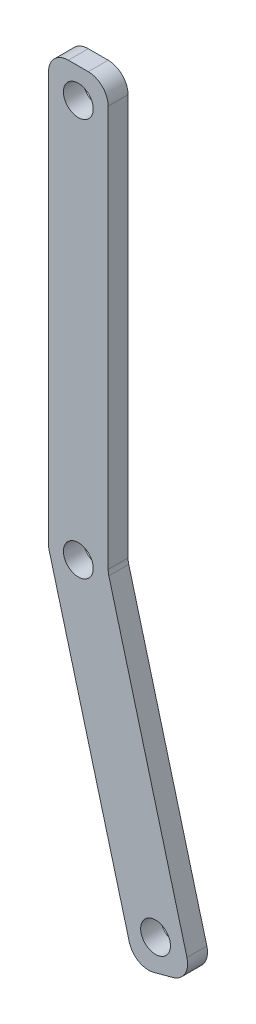
ISO-10303-21;
HEADER;
FILE_DESCRIPTION(('STEP AP214'),'2;1');
FILE_NAME('part.step','',(''),(''),'','','');
FILE_SCHEMA(('AUTOMOTIVE_DESIGN { 1 0 10303 214 1 1 1 1 }'));
ENDSEC;
DATA;
#1=APPLICATION_CONTEXT('core data for automotive mechanical design processes');
#2=APPLICATION_PROTOCOL_DEFINITION('international standard','automotive_design',2000,#1);
#3=PRODUCT_CONTEXT('',#1,'mechanical');
#4=PRODUCT('Part','Part','',(#3));
#5=PRODUCT_RELATED_PRODUCT_CATEGORY('part','',(#4));
#6=PRODUCT_DEFINITION_FORMATION('','',#4);
#7=PRODUCT_DEFINITION_CONTEXT('part definition',#1,'design');
#8=PRODUCT_DEFINITION('design','',#6,#7);
#9=PRODUCT_DEFINITION_SHAPE('','',#8);
#10=(LENGTH_UNIT() NAMED_UNIT(*) SI_UNIT(.MILLI.,.METRE.));
#11=(NAMED_UNIT(*) PLANE_ANGLE_UNIT() SI_UNIT($,.RADIAN.));
#12=(NAMED_UNIT(*) SI_UNIT($,.STERADIAN.) SOLID_ANGLE_UNIT());
#13=UNCERTAINTY_MEASURE_WITH_UNIT(LENGTH_MEASURE(1.E-05),#10,'distance_accuracy_value','');
#14=(GEOMETRIC_REPRESENTATION_CONTEXT(3) GLOBAL_UNCERTAINTY_ASSIGNED_CONTEXT((#13)) GLOBAL_UNIT_ASSIGNED_CONTEXT((#10,
#11,#12)) REPRESENTATION_CONTEXT('',''));
#15=CARTESIAN_POINT('',(0.,0.,0.));
#16=DIRECTION('',(0.,0.,1.));
#17=DIRECTION('',(1.,0.,0.));
#18=AXIS2_PLACEMENT_3D('',#15,#16,#17);
#19=CARTESIAN_POINT('',(-7.89777747886712,-2.1162030974631,2.));
#20=DIRECTION('',(-0.96592582628907,-0.258819045102515,0.));
#21=DIRECTION('',(0.258819045102515,-0.96592582628907,0.));
#22=AXIS2_PLACEMENT_3D('',#19,#20,#21);
#23=PLANE('',#22);
#24=DIRECTION('',(-0.258819045102515,0.96592582628907,0.));
#25=VECTOR('',#24,1.);
#26=CARTESIAN_POINT('',(-7.89777747886712,-2.1162030974631,0.));
#27=LINE('',#26,#25);
#28=CARTESIAN_POINT('',(5.12561291931073,-50.7201577502687,0.));
#29=VERTEX_POINT('',#28);
#30=CARTESIAN_POINT('',(-2.93185165257814,-20.6492905877925,0.));
#31=VERTEX_POINT('',#30);
#32=EDGE_CURVE('E152',#29,#31,#27,.T.);
#33=ORIENTED_EDGE('',*,*,#32,.F.);
#34=DIRECTION('',(0.,0.,-1.));
#35=VECTOR('',#34,1.);
#36=CARTESIAN_POINT('',(5.12561291931073,-50.7201577502687,2.));
#37=LINE('',#36,#35);
#38=CARTESIAN_POINT('',(5.12561291931073,-50.7201577502687,2.));
#39=VERTEX_POINT('',#38);
#40=EDGE_CURVE('E129',#29,#39,#37,.F.);
#41=ORIENTED_EDGE('',*,*,#40,.T.);
#42=DIRECTION('',(-0.258819045102515,0.96592582628907,0.));
#43=VECTOR('',#42,1.);
#44=CARTESIAN_POINT('',(-7.89777747886712,-2.1162030974631,2.));
#45=LINE('',#44,#43);
#46=CARTESIAN_POINT('',(-2.93185165257814,-20.6492905877925,2.));
#47=VERTEX_POINT('',#46);
#48=EDGE_CURVE('E177',#39,#47,#45,.T.);
#49=ORIENTED_EDGE('',*,*,#48,.T.);
#50=DIRECTION('',(0.,0.,-1.));
#51=VECTOR('',#50,1.);
#52=CARTESIAN_POINT('',(-2.93185165257814,-20.6492905877925,2.));
#53=LINE('',#52,#51);
#54=EDGE_CURVE('E134',#47,#31,#53,.T.);
#55=ORIENTED_EDGE('',*,*,#54,.T.);
#56=EDGE_LOOP('',(#33,#41,#49,#55));
#57=FACE_BOUND('',#56,.T.);
#58=ADVANCED_FACE('F34',(#57),#23,.T.);
#59=CARTESIAN_POINT('',(13.5410284883829,-50.5358063053838,2.));
#60=DIRECTION('',(-0.258819045102515,0.96592582628907,0.));
#61=DIRECTION('',(-0.96592582628907,-0.258819045102515,0.));
#62=AXIS2_PLACEMENT_3D('',#59,#60,#61);
#63=PLANE('',#62);
#64=DIRECTION('',(0.96592582628907,0.258819045102515,0.));
#65=VECTOR('',#64,1.);
#66=CARTESIAN_POINT('',(13.5410284883829,-50.5358063053838,2.));
#67=LINE('',#66,#65);
#68=CARTESIAN_POINT('',(7.5751026620939,-52.1343713126418,2.));
#69=VERTEX_POINT('',#68);
#70=CARTESIAN_POINT('',(9.50695431467204,-51.6167332224368,2.));
#71=VERTEX_POINT('',#70);
#72=EDGE_CURVE('E144',#69,#71,#67,.T.);
#73=ORIENTED_EDGE('',*,*,#72,.F.);
#74=DIRECTION('',(0.,0.,-1.));
#75=VECTOR('',#74,1.);
#76=CARTESIAN_POINT('',(7.5751026620939,-52.1343713126418,0.));
#77=LINE('',#76,#75);
#78=CARTESIAN_POINT('',(7.5751026620939,-52.1343713126418,0.));
#79=VERTEX_POINT('',#78);
#80=EDGE_CURVE('E128',#69,#79,#77,.T.);
#81=ORIENTED_EDGE('',*,*,#80,.T.);
#82=DIRECTION('',(0.96592582628907,0.258819045102515,0.));
#83=VECTOR('',#82,1.);
#84=CARTESIAN_POINT('',(13.5410284883829,-50.5358063053838,0.));
#85=LINE('',#84,#83);
#86=CARTESIAN_POINT('',(9.50695431467204,-51.6167332224368,0.));
#87=VERTEX_POINT('',#86);
#88=EDGE_CURVE('E141',#79,#87,#85,.T.);
#89=ORIENTED_EDGE('',*,*,#88,.T.);
#90=DIRECTION('',(0.,0.,-1.));
#91=VECTOR('',#90,1.);
#92=CARTESIAN_POINT('',(9.50695431467204,-51.6167332224368,2.));
#93=LINE('',#92,#91);
#94=EDGE_CURVE('E146',#87,#71,#93,.F.);
#95=ORIENTED_EDGE('',*,*,#94,.T.);
#96=EDGE_LOOP('',(#73,#81,#89,#95));
#97=FACE_BOUND('',#96,.T.);
#98=ADVANCED_FACE('F140',(#97),#63,.F.);
#99=CARTESIAN_POINT('',(-2.10222252113271,-0.563288826848014,2.));
#100=DIRECTION('',(-0.96592582628907,-0.258819045102515,0.));
#101=DIRECTION('',(0.258819045102515,-0.96592582628907,0.));
#102=AXIS2_PLACEMENT_3D('',#99,#100,#101);
#103=PLANE('',#102);
#104=DIRECTION('',(-0.258819045102515,0.96592582628907,0.));
#105=VECTOR('',#104,1.);
#106=CARTESIAN_POINT('',(-2.10222252113271,-0.563288826848014,2.));
#107=LINE('',#106,#105);
#108=CARTESIAN_POINT('',(10.9211678770451,-49.1672434796536,2.));
#109=VERTEX_POINT('',#108);
#110=CARTESIAN_POINT('',(3.06814834742186,-19.8593756022682,2.));
#111=VERTEX_POINT('',#110);
#112=EDGE_CURVE('E234',#109,#111,#107,.T.);
#113=ORIENTED_EDGE('',*,*,#112,.F.);
#114=DIRECTION('',(0.,0.,-1.));
#115=VECTOR('',#114,1.);
#116=CARTESIAN_POINT('',(10.9211678770451,-49.1672434796536,2.));
#117=LINE('',#116,#115);
#118=CARTESIAN_POINT('',(10.9211678770451,-49.1672434796536,0.));
#119=VERTEX_POINT('',#118);
#120=EDGE_CURVE('E200',#109,#119,#117,.T.);
#121=ORIENTED_EDGE('',*,*,#120,.T.);
#122=DIRECTION('',(-0.258819045102515,0.96592582628907,0.));
#123=VECTOR('',#122,1.);
#124=CARTESIAN_POINT('',(-2.10222252113271,-0.563288826848014,0.));
#125=LINE('',#124,#123);
#126=CARTESIAN_POINT('',(3.06814834742186,-19.8593756022682,0.));
#127=VERTEX_POINT('',#126);
#128=EDGE_CURVE('E151',#119,#127,#125,.T.);
#129=ORIENTED_EDGE('',*,*,#128,.T.);
#130=DIRECTION('',(0.,0.,-1.));
#131=VECTOR('',#130,1.);
#132=CARTESIAN_POINT('',(3.06814834742186,-19.8593756022682,2.));
#133=LINE('',#132,#131);
#134=EDGE_CURVE('E198',#127,#111,#133,.F.);
#135=ORIENTED_EDGE('',*,*,#134,.T.);
#136=EDGE_LOOP('',(#113,#121,#129,#135));
#137=FACE_BOUND('',#136,.T.);
#138=ADVANCED_FACE('F222',(#137),#103,.F.);
#139=CARTESIAN_POINT('',(3.,0.,2.));
#140=DIRECTION('',(-1.,0.,0.));
#141=DIRECTION('',(0.,0.,1.));
#142=AXIS2_PLACEMENT_3D('',#139,#140,#141);
#143=PLANE('',#142);
#144=DIRECTION('',(0.,1.,0.));
#145=VECTOR('',#144,1.);
#146=CARTESIAN_POINT('',(3.,0.,2.));
#147=LINE('',#146,#145);
#148=CARTESIAN_POINT('',(3.,-19.3417375120631,2.));
#149=VERTEX_POINT('',#148);
#150=CARTESIAN_POINT('',(3.,21.,2.));
#151=VERTEX_POINT('',#150);
#152=EDGE_CURVE('E232',#149,#151,#147,.T.);
#153=ORIENTED_EDGE('',*,*,#152,.F.);
#154=DIRECTION('',(0.,0.,-1.));
#155=VECTOR('',#154,1.);
#156=CARTESIAN_POINT('',(3.,-19.3417375120631,0.));
#157=LINE('',#156,#155);
#158=CARTESIAN_POINT('',(3.,-19.3417375120631,0.));
#159=VERTEX_POINT('',#158);
#160=EDGE_CURVE('E209',#149,#159,#157,.T.);
#161=ORIENTED_EDGE('',*,*,#160,.T.);
#162=DIRECTION('',(0.,1.,0.));
#163=VECTOR('',#162,1.);
#164=CARTESIAN_POINT('',(3.,0.,0.));
#165=LINE('',#164,#163);
#166=CARTESIAN_POINT('',(3.,21.,0.));
#167=VERTEX_POINT('',#166);
#168=EDGE_CURVE('E155',#159,#167,#165,.T.);
#169=ORIENTED_EDGE('',*,*,#168,.T.);
#170=DIRECTION('',(0.,0.,-1.));
#171=VECTOR('',#170,1.);
#172=CARTESIAN_POINT('',(3.,21.,2.));
#173=LINE('',#172,#171);
#174=EDGE_CURVE('E207',#167,#151,#173,.F.);
#175=ORIENTED_EDGE('',*,*,#174,.T.);
#176=EDGE_LOOP('',(#153,#161,#169,#175));
#177=FACE_BOUND('',#176,.T.);
#178=ADVANCED_FACE('F236',(#177),#143,.F.);
#179=CARTESIAN_POINT('',(0.,23.,2.));
#180=DIRECTION('',(0.,1.,0.));
#181=DIRECTION('',(0.,0.,1.));
#182=AXIS2_PLACEMENT_3D('',#179,#180,#181);
#183=PLANE('',#182);
#184=DIRECTION('',(1.,0.,0.));
#185=VECTOR('',#184,1.);
#186=CARTESIAN_POINT('',(0.,23.,0.));
#187=LINE('',#186,#185);
#188=CARTESIAN_POINT('',(-1.,23.,0.));
#189=VERTEX_POINT('',#188);
#190=CARTESIAN_POINT('',(1.,23.,0.));
#191=VERTEX_POINT('',#190);
#192=EDGE_CURVE('E162',#189,#191,#187,.T.);
#193=ORIENTED_EDGE('',*,*,#192,.F.);
#194=DIRECTION('',(0.,0.,-1.));
#195=VECTOR('',#194,1.);
#196=CARTESIAN_POINT('',(-1.,23.,2.));
#197=LINE('',#196,#195);
#198=CARTESIAN_POINT('',(-1.,23.,2.));
#199=VERTEX_POINT('',#198);
#200=EDGE_CURVE('E215',#189,#199,#197,.F.);
#201=ORIENTED_EDGE('',*,*,#200,.T.);
#202=DIRECTION('',(1.,0.,0.));
#203=VECTOR('',#202,1.);
#204=CARTESIAN_POINT('',(0.,23.,2.));
#205=LINE('',#204,#203);
#206=CARTESIAN_POINT('',(1.,23.,2.));
#207=VERTEX_POINT('',#206);
#208=EDGE_CURVE('E238',#199,#207,#205,.T.);
#209=ORIENTED_EDGE('',*,*,#208,.T.);
#210=DIRECTION('',(0.,0.,-1.));
#211=VECTOR('',#210,1.);
#212=CARTESIAN_POINT('',(1.,23.,0.));
#213=LINE('',#212,#211);
#214=EDGE_CURVE('E212',#207,#191,#213,.T.);
#215=ORIENTED_EDGE('',*,*,#214,.T.);
#216=EDGE_LOOP('',(#193,#201,#209,#215));
#217=FACE_BOUND('',#216,.T.);
#218=ADVANCED_FACE('F303',(#217),#183,.T.);
#219=CARTESIAN_POINT('',(0.,-20.,2.));
#220=DIRECTION('',(0.,0.,-1.));
#221=DIRECTION('',(-1.,0.,0.));
#222=AXIS2_PLACEMENT_3D('',#219,#220,#221);
#223=CYLINDRICAL_SURFACE('',#222,1.5);
#224=CARTESIAN_POINT('',(0.,-20.,2.));
#225=DIRECTION('',(0.,0.,1.));
#226=DIRECTION('',(1.,0.,0.));
#227=AXIS2_PLACEMENT_3D('',#224,#225,#226);
#228=CIRCLE('',#227,1.5);
#229=CARTESIAN_POINT('',(1.5,-20.,2.));
#230=VERTEX_POINT('',#229);
#231=EDGE_CURVE('E250',#230,#230,#228,.T.);
#232=ORIENTED_EDGE('',*,*,#231,.T.);
#233=EDGE_LOOP('',(#232));
#234=FACE_BOUND('',#233,.T.);
#235=CARTESIAN_POINT('',(0.,-20.,0.));
#236=DIRECTION('',(0.,0.,1.));
#237=DIRECTION('',(1.,0.,0.));
#238=AXIS2_PLACEMENT_3D('',#235,#236,#237);
#239=CIRCLE('',#238,1.5);
#240=CARTESIAN_POINT('',(1.5,-20.,0.));
#241=VERTEX_POINT('',#240);
#242=EDGE_CURVE('E171',#241,#241,#239,.T.);
#243=ORIENTED_EDGE('',*,*,#242,.F.);
#244=EDGE_LOOP('',(#243));
#245=FACE_BOUND('',#244,.T.);
#246=ADVANCED_FACE('F306',(#234,#245),#223,.F.);
#247=CARTESIAN_POINT('',(7.76457135307543,-48.9777747886721,2.));
#248=DIRECTION('',(0.,0.,-1.));
#249=DIRECTION('',(-1.,0.,0.));
#250=AXIS2_PLACEMENT_3D('',#247,#248,#249);
#251=CYLINDRICAL_SURFACE('',#250,1.5);
#252=CARTESIAN_POINT('',(7.76457135307543,-48.9777747886721,2.));
#253=DIRECTION('',(0.,0.,1.));
#254=DIRECTION('',(1.,0.,0.));
#255=AXIS2_PLACEMENT_3D('',#252,#253,#254);
#256=CIRCLE('',#255,1.5);
#257=CARTESIAN_POINT('',(9.26457135307543,-48.9777747886721,2.));
#258=VERTEX_POINT('',#257);
#259=EDGE_CURVE('E247',#258,#258,#256,.T.);
#260=ORIENTED_EDGE('',*,*,#259,.T.);
#261=EDGE_LOOP('',(#260));
#262=FACE_BOUND('',#261,.T.);
#263=CARTESIAN_POINT('',(7.76457135307543,-48.9777747886721,0.));
#264=DIRECTION('',(0.,0.,1.));
#265=DIRECTION('',(1.,0.,0.));
#266=AXIS2_PLACEMENT_3D('',#263,#264,#265);
#267=CIRCLE('',#266,1.5);
#268=CARTESIAN_POINT('',(9.26457135307543,-48.9777747886721,0.));
#269=VERTEX_POINT('',#268);
#270=EDGE_CURVE('E168',#269,#269,#267,.T.);
#271=ORIENTED_EDGE('',*,*,#270,.F.);
#272=EDGE_LOOP('',(#271));
#273=FACE_BOUND('',#272,.T.);
#274=ADVANCED_FACE('F312',(#262,#273),#251,.F.);
#275=CARTESIAN_POINT('',(-3.,0.,2.));
#276=DIRECTION('',(-1.,0.,0.));
#277=DIRECTION('',(0.,0.,1.));
#278=AXIS2_PLACEMENT_3D('',#275,#276,#277);
#279=PLANE('',#278);
#280=DIRECTION('',(0.,1.,0.));
#281=VECTOR('',#280,1.);
#282=CARTESIAN_POINT('',(-3.,0.,0.));
#283=LINE('',#282,#281);
#284=CARTESIAN_POINT('',(-3.,-20.1316524975875,0.));
#285=VERTEX_POINT('',#284);
#286=CARTESIAN_POINT('',(-3.,21.,0.));
#287=VERTEX_POINT('',#286);
#288=EDGE_CURVE('E165',#285,#287,#283,.T.);
#289=ORIENTED_EDGE('',*,*,#288,.F.);
#290=DIRECTION('',(0.,0.,-1.));
#291=VECTOR('',#290,1.);
#292=CARTESIAN_POINT('',(-3.,-20.1316524975875,2.));
#293=LINE('',#292,#291);
#294=CARTESIAN_POINT('',(-3.,-20.1316524975875,2.));
#295=VERTEX_POINT('',#294);
#296=EDGE_CURVE('E56',#285,#295,#293,.F.);
#297=ORIENTED_EDGE('',*,*,#296,.T.);
#298=DIRECTION('',(0.,1.,0.));
#299=VECTOR('',#298,1.);
#300=CARTESIAN_POINT('',(-3.,0.,2.));
#301=LINE('',#300,#299);
#302=CARTESIAN_POINT('',(-3.,21.,2.));
#303=VERTEX_POINT('',#302);
#304=EDGE_CURVE('E241',#295,#303,#301,.T.);
#305=ORIENTED_EDGE('',*,*,#304,.T.);
#306=DIRECTION('',(0.,0.,-1.));
#307=VECTOR('',#306,1.);
#308=CARTESIAN_POINT('',(-3.,21.,2.));
#309=LINE('',#308,#307);
#310=EDGE_CURVE('E203',#303,#287,#309,.T.);
#311=ORIENTED_EDGE('',*,*,#310,.T.);
#312=EDGE_LOOP('',(#289,#297,#305,#311));
#313=FACE_BOUND('',#312,.T.);
#314=ADVANCED_FACE('F265',(#313),#279,.T.);
#315=CARTESIAN_POINT('',(0.,20.,2.));
#316=DIRECTION('',(0.,0.,-1.));
#317=DIRECTION('',(-1.,0.,0.));
#318=AXIS2_PLACEMENT_3D('',#315,#316,#317);
#319=CYLINDRICAL_SURFACE('',#318,1.5);
#320=CARTESIAN_POINT('',(0.,20.,2.));
#321=DIRECTION('',(0.,0.,1.));
#322=DIRECTION('',(1.,0.,0.));
#323=AXIS2_PLACEMENT_3D('',#320,#321,#322);
#324=CIRCLE('',#323,1.5);
#325=CARTESIAN_POINT('',(1.49999999999999,20.,2.));
#326=VERTEX_POINT('',#325);
#327=EDGE_CURVE('E178',#326,#326,#324,.T.);
#328=ORIENTED_EDGE('',*,*,#327,.T.);
#329=EDGE_LOOP('',(#328));
#330=FACE_BOUND('',#329,.T.);
#331=CARTESIAN_POINT('',(0.,20.,0.));
#332=DIRECTION('',(0.,0.,1.));
#333=DIRECTION('',(1.,0.,0.));
#334=AXIS2_PLACEMENT_3D('',#331,#332,#333);
#335=CIRCLE('',#334,1.5);
#336=CARTESIAN_POINT('',(1.49999999999999,20.,0.));
#337=VERTEX_POINT('',#336);
#338=EDGE_CURVE('E174',#337,#337,#335,.T.);
#339=ORIENTED_EDGE('',*,*,#338,.F.);
#340=EDGE_LOOP('',(#339));
#341=FACE_BOUND('',#340,.T.);
#342=ADVANCED_FACE('F255',(#330,#341),#319,.F.);
#343=CARTESIAN_POINT('',(0.,0.,2.));
#344=DIRECTION('',(0.,0.,1.));
#345=DIRECTION('',(1.,0.,0.));
#346=AXIS2_PLACEMENT_3D('',#343,#344,#345);
#347=PLANE('',#346);
#348=ORIENTED_EDGE('',*,*,#48,.F.);
#349=CARTESIAN_POINT('',(7.05746457188887,-50.2025196600637,2.));
#350=DIRECTION('',(0.,0.,1.));
#351=DIRECTION('',(1.,0.,0.));
#352=AXIS2_PLACEMENT_3D('',#349,#350,#351);
#353=CIRCLE('',#352,2.);
#354=EDGE_CURVE('E196',#39,#69,#353,.T.);
#355=ORIENTED_EDGE('',*,*,#354,.T.);
#356=ORIENTED_EDGE('',*,*,#72,.T.);
#357=CARTESIAN_POINT('',(8.98931622446701,-49.6848815698586,2.));
#358=DIRECTION('',(0.,0.,1.));
#359=DIRECTION('',(1.,0.,0.));
#360=AXIS2_PLACEMENT_3D('',#357,#358,#359);
#361=CIRCLE('',#360,2.);
#362=EDGE_CURVE('E194',#71,#109,#361,.T.);
#363=ORIENTED_EDGE('',*,*,#362,.T.);
#364=ORIENTED_EDGE('',*,*,#112,.T.);
#365=CARTESIAN_POINT('',(5.,-19.3417375120631,2.));
#366=DIRECTION('',(0.,0.,1.));
#367=DIRECTION('',(1.,0.,0.));
#368=AXIS2_PLACEMENT_3D('',#365,#366,#367);
#369=CIRCLE('',#368,2.);
#370=EDGE_CURVE('E11',#111,#149,#369,.F.);
#371=ORIENTED_EDGE('',*,*,#370,.T.);
#372=ORIENTED_EDGE('',*,*,#152,.T.);
#373=CARTESIAN_POINT('',(1.,21.,2.));
#374=DIRECTION('',(0.,0.,1.));
#375=DIRECTION('',(1.,0.,0.));
#376=AXIS2_PLACEMENT_3D('',#373,#374,#375);
#377=CIRCLE('',#376,2.);
#378=EDGE_CURVE('E189',#151,#207,#377,.T.);
#379=ORIENTED_EDGE('',*,*,#378,.T.);
#380=ORIENTED_EDGE('',*,*,#208,.F.);
#381=CARTESIAN_POINT('',(-1.,21.,2.));
#382=DIRECTION('',(0.,0.,1.));
#383=DIRECTION('',(1.,0.,0.));
#384=AXIS2_PLACEMENT_3D('',#381,#382,#383);
#385=CIRCLE('',#384,2.);
#386=EDGE_CURVE('E49',#199,#303,#385,.T.);
#387=ORIENTED_EDGE('',*,*,#386,.T.);
#388=ORIENTED_EDGE('',*,*,#304,.F.);
#389=CARTESIAN_POINT('',(-1.,-20.1316524975875,2.));
#390=DIRECTION('',(0.,0.,1.));
#391=DIRECTION('',(1.,0.,0.));
#392=AXIS2_PLACEMENT_3D('',#389,#390,#391);
#393=CIRCLE('',#392,2.);
#394=EDGE_CURVE('E192',#295,#47,#393,.T.);
#395=ORIENTED_EDGE('',*,*,#394,.T.);
#396=EDGE_LOOP('',(#348,#355,#356,#363,#364,#371,#372,#379,#380,#387,#388,#395));
#397=FACE_BOUND('',#396,.T.);
#398=ORIENTED_EDGE('',*,*,#259,.F.);
#399=EDGE_LOOP('',(#398));
#400=FACE_BOUND('',#399,.T.);
#401=ORIENTED_EDGE('',*,*,#231,.F.);
#402=EDGE_LOOP('',(#401));
#403=FACE_BOUND('',#402,.T.);
#404=ORIENTED_EDGE('',*,*,#327,.F.);
#405=EDGE_LOOP('',(#404));
#406=FACE_BOUND('',#405,.T.);
#407=ADVANCED_FACE('F230',(#397,#400,#403,#406),#347,.T.);
#408=CARTESIAN_POINT('',(0.,0.,0.));
#409=DIRECTION('',(0.,0.,1.));
#410=DIRECTION('',(1.,0.,0.));
#411=AXIS2_PLACEMENT_3D('',#408,#409,#410);
#412=PLANE('',#411);
#413=ORIENTED_EDGE('',*,*,#88,.F.);
#414=CARTESIAN_POINT('',(7.05746457188887,-50.2025196600637,0.));
#415=DIRECTION('',(0.,0.,1.));
#416=DIRECTION('',(1.,0.,0.));
#417=AXIS2_PLACEMENT_3D('',#414,#415,#416);
#418=CIRCLE('',#417,2.);
#419=EDGE_CURVE('E124',#79,#29,#418,.F.);
#420=ORIENTED_EDGE('',*,*,#419,.T.);
#421=ORIENTED_EDGE('',*,*,#32,.T.);
#422=CARTESIAN_POINT('',(-1.,-20.1316524975875,0.));
#423=DIRECTION('',(0.,0.,1.));
#424=DIRECTION('',(1.,0.,0.));
#425=AXIS2_PLACEMENT_3D('',#422,#423,#424);
#426=CIRCLE('',#425,2.);
#427=EDGE_CURVE('E183',#31,#285,#426,.F.);
#428=ORIENTED_EDGE('',*,*,#427,.T.);
#429=ORIENTED_EDGE('',*,*,#288,.T.);
#430=CARTESIAN_POINT('',(-1.,21.,0.));
#431=DIRECTION('',(0.,0.,1.));
#432=DIRECTION('',(1.,0.,0.));
#433=AXIS2_PLACEMENT_3D('',#430,#431,#432);
#434=CIRCLE('',#433,2.);
#435=EDGE_CURVE('E181',#287,#189,#434,.F.);
#436=ORIENTED_EDGE('',*,*,#435,.T.);
#437=ORIENTED_EDGE('',*,*,#192,.T.);
#438=CARTESIAN_POINT('',(1.,21.,0.));
#439=DIRECTION('',(0.,0.,1.));
#440=DIRECTION('',(1.,0.,0.));
#441=AXIS2_PLACEMENT_3D('',#438,#439,#440);
#442=CIRCLE('',#441,2.);
#443=EDGE_CURVE('E145',#191,#167,#442,.F.);
#444=ORIENTED_EDGE('',*,*,#443,.T.);
#445=ORIENTED_EDGE('',*,*,#168,.F.);
#446=CARTESIAN_POINT('',(5.,-19.3417375120631,0.));
#447=DIRECTION('',(0.,0.,1.));
#448=DIRECTION('',(1.,0.,0.));
#449=AXIS2_PLACEMENT_3D('',#446,#447,#448);
#450=CIRCLE('',#449,2.);
#451=EDGE_CURVE('E42',#159,#127,#450,.T.);
#452=ORIENTED_EDGE('',*,*,#451,.T.);
#453=ORIENTED_EDGE('',*,*,#128,.F.);
#454=CARTESIAN_POINT('',(8.98931622446701,-49.6848815698586,0.));
#455=DIRECTION('',(0.,0.,1.));
#456=DIRECTION('',(1.,0.,0.));
#457=AXIS2_PLACEMENT_3D('',#454,#455,#456);
#458=CIRCLE('',#457,2.);
#459=EDGE_CURVE('E135',#119,#87,#458,.F.);
#460=ORIENTED_EDGE('',*,*,#459,.T.);
#461=EDGE_LOOP('',(#413,#420,#421,#428,#429,#436,#437,#444,#445,#452,#453,#460));
#462=FACE_BOUND('',#461,.T.);
#463=ORIENTED_EDGE('',*,*,#270,.T.);
#464=EDGE_LOOP('',(#463));
#465=FACE_BOUND('',#464,.T.);
#466=ORIENTED_EDGE('',*,*,#242,.T.);
#467=EDGE_LOOP('',(#466));
#468=FACE_BOUND('',#467,.T.);
#469=ORIENTED_EDGE('',*,*,#338,.T.);
#470=EDGE_LOOP('',(#469));
#471=FACE_BOUND('',#470,.T.);
#472=ADVANCED_FACE('F148',(#462,#465,#468,#471),#412,.F.);
#473=CARTESIAN_POINT('',(7.05746457188887,-50.2025196600637,2.));
#474=DIRECTION('',(0.,0.,1.));
#475=DIRECTION('',(1.,0.,0.));
#476=AXIS2_PLACEMENT_3D('',#473,#474,#475);
#477=CYLINDRICAL_SURFACE('',#476,2.);
#478=ORIENTED_EDGE('',*,*,#354,.F.);
#479=ORIENTED_EDGE('',*,*,#40,.F.);
#480=ORIENTED_EDGE('',*,*,#419,.F.);
#481=ORIENTED_EDGE('',*,*,#80,.F.);
#482=EDGE_LOOP('',(#478,#479,#480,#481));
#483=FACE_BOUND('',#482,.T.);
#484=ADVANCED_FACE('F127',(#483),#477,.T.);
#485=CARTESIAN_POINT('',(8.98931622446701,-49.6848815698586,2.));
#486=DIRECTION('',(0.,0.,-1.));
#487=DIRECTION('',(-1.,0.,0.));
#488=AXIS2_PLACEMENT_3D('',#485,#486,#487);
#489=CYLINDRICAL_SURFACE('',#488,2.);
#490=ORIENTED_EDGE('',*,*,#362,.F.);
#491=ORIENTED_EDGE('',*,*,#94,.F.);
#492=ORIENTED_EDGE('',*,*,#459,.F.);
#493=ORIENTED_EDGE('',*,*,#120,.F.);
#494=EDGE_LOOP('',(#490,#491,#492,#493));
#495=FACE_BOUND('',#494,.T.);
#496=ADVANCED_FACE('F278',(#495),#489,.T.);
#497=CARTESIAN_POINT('',(-1.,-20.1316524975875,2.));
#498=DIRECTION('',(0.,0.,-1.));
#499=DIRECTION('',(-1.,0.,0.));
#500=AXIS2_PLACEMENT_3D('',#497,#498,#499);
#501=CYLINDRICAL_SURFACE('',#500,2.);
#502=ORIENTED_EDGE('',*,*,#394,.F.);
#503=ORIENTED_EDGE('',*,*,#296,.F.);
#504=ORIENTED_EDGE('',*,*,#427,.F.);
#505=ORIENTED_EDGE('',*,*,#54,.F.);
#506=EDGE_LOOP('',(#502,#503,#504,#505));
#507=FACE_BOUND('',#506,.T.);
#508=ADVANCED_FACE('F281',(#507),#501,.T.);
#509=CARTESIAN_POINT('',(5.,-19.3417375120631,2.));
#510=DIRECTION('',(0.,0.,1.));
#511=DIRECTION('',(1.,0.,0.));
#512=AXIS2_PLACEMENT_3D('',#509,#510,#511);
#513=CYLINDRICAL_SURFACE('',#512,2.);
#514=ORIENTED_EDGE('',*,*,#370,.F.);
#515=ORIENTED_EDGE('',*,*,#134,.F.);
#516=ORIENTED_EDGE('',*,*,#451,.F.);
#517=ORIENTED_EDGE('',*,*,#160,.F.);
#518=EDGE_LOOP('',(#514,#515,#516,#517));
#519=FACE_BOUND('',#518,.T.);
#520=ADVANCED_FACE('F226',(#519),#513,.F.);
#521=CARTESIAN_POINT('',(-1.,21.,2.));
#522=DIRECTION('',(0.,0.,-1.));
#523=DIRECTION('',(-1.,0.,0.));
#524=AXIS2_PLACEMENT_3D('',#521,#522,#523);
#525=CYLINDRICAL_SURFACE('',#524,2.);
#526=ORIENTED_EDGE('',*,*,#386,.F.);
#527=ORIENTED_EDGE('',*,*,#200,.F.);
#528=ORIENTED_EDGE('',*,*,#435,.F.);
#529=ORIENTED_EDGE('',*,*,#310,.F.);
#530=EDGE_LOOP('',(#526,#527,#528,#529));
#531=FACE_BOUND('',#530,.T.);
#532=ADVANCED_FACE('F287',(#531),#525,.T.);
#533=CARTESIAN_POINT('',(1.,21.,2.));
#534=DIRECTION('',(0.,0.,1.));
#535=DIRECTION('',(1.,0.,0.));
#536=AXIS2_PLACEMENT_3D('',#533,#534,#535);
#537=CYLINDRICAL_SURFACE('',#536,2.);
#538=ORIENTED_EDGE('',*,*,#378,.F.);
#539=ORIENTED_EDGE('',*,*,#174,.F.);
#540=ORIENTED_EDGE('',*,*,#443,.F.);
#541=ORIENTED_EDGE('',*,*,#214,.F.);
#542=EDGE_LOOP('',(#538,#539,#540,#541));
#543=FACE_BOUND('',#542,.T.);
#544=ADVANCED_FACE('F36',(#543),#537,.T.);
#545=CLOSED_SHELL('',(#58,#98,#138,#178,#218,#246,#274,#314,#342,#407,#472,#484,#496,#508,#520,
#532,#544));
#546=MANIFOLD_SOLID_BREP('B2',#545);
#547=ADVANCED_BREP_SHAPE_REPRESENTATION('',(#18,#546),#14);
#548=SHAPE_DEFINITION_REPRESENTATION(#9,#547);
ENDSEC;
END-ISO-10303-21;
